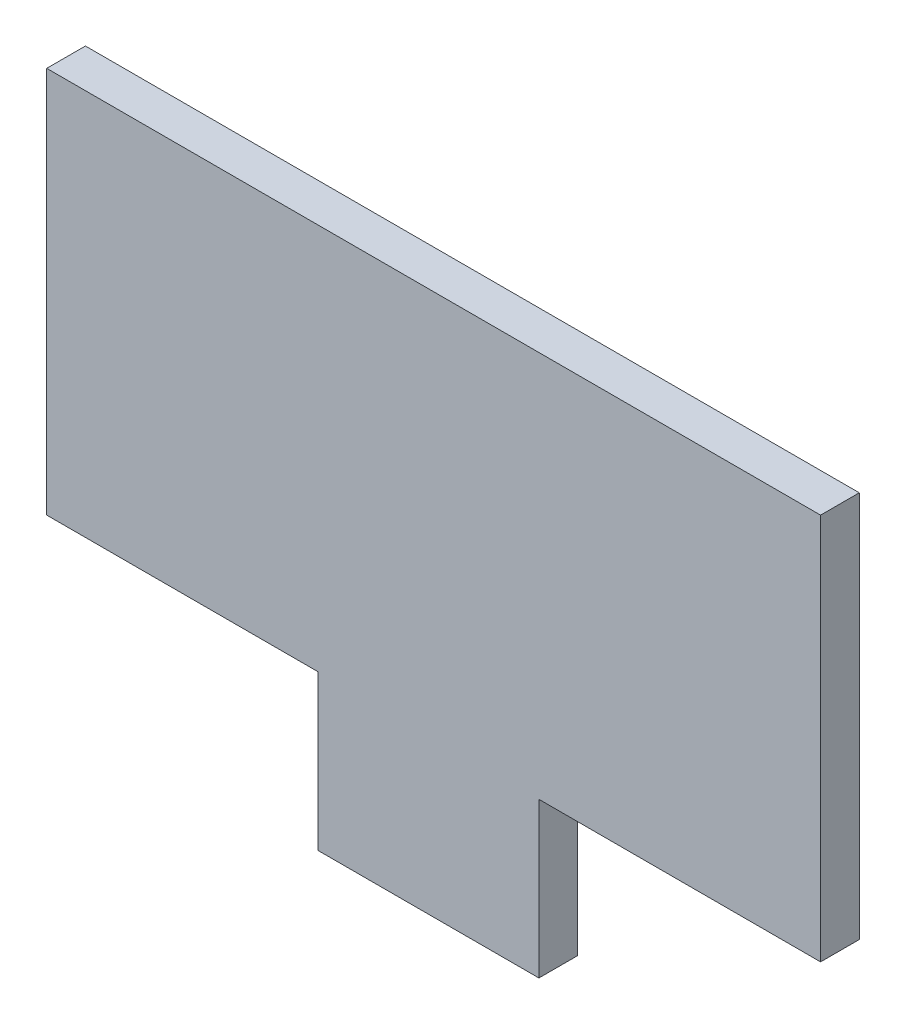
ISO-10303-21;
HEADER;
FILE_DESCRIPTION(('STEP AP214'),'2;1');
FILE_NAME('part.step','',(''),(''),'','','');
FILE_SCHEMA(('AUTOMOTIVE_DESIGN { 1 0 10303 214 1 1 1 1 }'));
ENDSEC;
DATA;
#1=APPLICATION_CONTEXT('core data for automotive mechanical design processes');
#2=APPLICATION_PROTOCOL_DEFINITION('international standard','automotive_design',2000,#1);
#3=PRODUCT_CONTEXT('',#1,'mechanical');
#4=PRODUCT('Part','Part','',(#3));
#5=PRODUCT_RELATED_PRODUCT_CATEGORY('part','',(#4));
#6=PRODUCT_DEFINITION_FORMATION('','',#4);
#7=PRODUCT_DEFINITION_CONTEXT('part definition',#1,'design');
#8=PRODUCT_DEFINITION('design','',#6,#7);
#9=PRODUCT_DEFINITION_SHAPE('','',#8);
#10=(LENGTH_UNIT() NAMED_UNIT(*) SI_UNIT(.MILLI.,.METRE.));
#11=(NAMED_UNIT(*) PLANE_ANGLE_UNIT() SI_UNIT($,.RADIAN.));
#12=(NAMED_UNIT(*) SI_UNIT($,.STERADIAN.) SOLID_ANGLE_UNIT());
#13=UNCERTAINTY_MEASURE_WITH_UNIT(LENGTH_MEASURE(1.E-05),#10,'distance_accuracy_value','');
#14=(GEOMETRIC_REPRESENTATION_CONTEXT(3) GLOBAL_UNCERTAINTY_ASSIGNED_CONTEXT((#13)) GLOBAL_UNIT_ASSIGNED_CONTEXT((#10,
#11,#12)) REPRESENTATION_CONTEXT('',''));
#15=CARTESIAN_POINT('',(0.,0.,0.));
#16=DIRECTION('',(0.,0.,1.));
#17=DIRECTION('',(1.,0.,0.));
#18=AXIS2_PLACEMENT_3D('',#15,#16,#17);
#19=CARTESIAN_POINT('',(51.2195121951221,0.,2.5));
#20=DIRECTION('',(1.,0.,0.));
#21=DIRECTION('',(0.,0.,-1.));
#22=AXIS2_PLACEMENT_3D('',#19,#20,#21);
#23=PLANE('',#22);
#24=DIRECTION('',(0.,-1.,0.));
#25=VECTOR('',#24,1.);
#26=CARTESIAN_POINT('',(51.2195121951221,0.,0.));
#27=LINE('',#26,#25);
#28=CARTESIAN_POINT('',(51.2195121951221,25.281425891182,0.));
#29=VERTEX_POINT('',#28);
#30=CARTESIAN_POINT('',(51.2195121951221,0.281425891181995,0.));
#31=VERTEX_POINT('',#30);
#32=EDGE_CURVE('E146',#29,#31,#27,.T.);
#33=ORIENTED_EDGE('',*,*,#32,.F.);
#34=DIRECTION('',(0.,0.,-1.));
#35=VECTOR('',#34,1.);
#36=CARTESIAN_POINT('',(51.2195121951221,25.281425891182,2.5));
#37=LINE('',#36,#35);
#38=CARTESIAN_POINT('',(51.2195121951221,25.281425891182,2.5));
#39=VERTEX_POINT('',#38);
#40=EDGE_CURVE('E11',#39,#29,#37,.T.);
#41=ORIENTED_EDGE('',*,*,#40,.F.);
#42=DIRECTION('',(0.,-1.,0.));
#43=VECTOR('',#42,1.);
#44=CARTESIAN_POINT('',(51.2195121951221,0.,2.5));
#45=LINE('',#44,#43);
#46=CARTESIAN_POINT('',(51.2195121951221,0.281425891181995,2.5));
#47=VERTEX_POINT('',#46);
#48=EDGE_CURVE('E200',#39,#47,#45,.T.);
#49=ORIENTED_EDGE('',*,*,#48,.T.);
#50=DIRECTION('',(0.,0.,-1.));
#51=VECTOR('',#50,1.);
#52=CARTESIAN_POINT('',(51.2195121951221,0.281425891181995,2.5));
#53=LINE('',#52,#51);
#54=EDGE_CURVE('E98',#47,#31,#53,.T.);
#55=ORIENTED_EDGE('',*,*,#54,.T.);
#56=EDGE_LOOP('',(#33,#41,#49,#55));
#57=FACE_BOUND('',#56,.T.);
#58=ADVANCED_FACE('F47',(#57),#23,.T.);
#59=CARTESIAN_POINT('',(0.,25.281425891182,2.5));
#60=DIRECTION('',(0.,1.,0.));
#61=DIRECTION('',(0.,0.,1.));
#62=AXIS2_PLACEMENT_3D('',#59,#60,#61);
#63=PLANE('',#62);
#64=DIRECTION('',(1.,0.,0.));
#65=VECTOR('',#64,1.);
#66=CARTESIAN_POINT('',(0.,25.281425891182,0.));
#67=LINE('',#66,#65);
#68=CARTESIAN_POINT('',(1.21951219512215,25.281425891182,0.));
#69=VERTEX_POINT('',#68);
#70=EDGE_CURVE('E150',#69,#29,#67,.T.);
#71=ORIENTED_EDGE('',*,*,#70,.F.);
#72=DIRECTION('',(0.,0.,-1.));
#73=VECTOR('',#72,1.);
#74=CARTESIAN_POINT('',(1.21951219512215,25.281425891182,2.5));
#75=LINE('',#74,#73);
#76=CARTESIAN_POINT('',(1.21951219512215,25.281425891182,2.5));
#77=VERTEX_POINT('',#76);
#78=EDGE_CURVE('E56',#77,#69,#75,.T.);
#79=ORIENTED_EDGE('',*,*,#78,.F.);
#80=DIRECTION('',(1.,0.,0.));
#81=VECTOR('',#80,1.);
#82=CARTESIAN_POINT('',(0.,25.281425891182,2.5));
#83=LINE('',#82,#81);
#84=EDGE_CURVE('E198',#77,#39,#83,.T.);
#85=ORIENTED_EDGE('',*,*,#84,.T.);
#86=ORIENTED_EDGE('',*,*,#40,.T.);
#87=EDGE_LOOP('',(#71,#79,#85,#86));
#88=FACE_BOUND('',#87,.T.);
#89=ADVANCED_FACE('F197',(#88),#63,.T.);
#90=CARTESIAN_POINT('',(1.21951219512215,0.,2.5));
#91=DIRECTION('',(1.,0.,0.));
#92=DIRECTION('',(0.,1.,0.));
#93=AXIS2_PLACEMENT_3D('',#90,#91,#92);
#94=PLANE('',#93);
#95=DIRECTION('',(0.,-1.,0.));
#96=VECTOR('',#95,1.);
#97=CARTESIAN_POINT('',(1.21951219512215,0.,0.));
#98=LINE('',#97,#96);
#99=CARTESIAN_POINT('',(1.21951219512215,0.281425891181995,0.));
#100=VERTEX_POINT('',#99);
#101=EDGE_CURVE('E154',#69,#100,#98,.T.);
#102=ORIENTED_EDGE('',*,*,#101,.T.);
#103=DIRECTION('',(0.,0.,-1.));
#104=VECTOR('',#103,1.);
#105=CARTESIAN_POINT('',(1.21951219512215,0.281425891181995,2.5));
#106=LINE('',#105,#104);
#107=CARTESIAN_POINT('',(1.21951219512215,0.281425891181995,2.5));
#108=VERTEX_POINT('',#107);
#109=EDGE_CURVE('E179',#108,#100,#106,.T.);
#110=ORIENTED_EDGE('',*,*,#109,.F.);
#111=DIRECTION('',(0.,-1.,0.));
#112=VECTOR('',#111,1.);
#113=CARTESIAN_POINT('',(1.21951219512215,0.,2.5));
#114=LINE('',#113,#112);
#115=EDGE_CURVE('E188',#77,#108,#114,.T.);
#116=ORIENTED_EDGE('',*,*,#115,.F.);
#117=ORIENTED_EDGE('',*,*,#78,.T.);
#118=EDGE_LOOP('',(#102,#110,#116,#117));
#119=FACE_BOUND('',#118,.T.);
#120=ADVANCED_FACE('F186',(#119),#94,.F.);
#121=CARTESIAN_POINT('',(0.,0.281425891181995,2.5));
#122=DIRECTION('',(0.,1.,0.));
#123=DIRECTION('',(0.,0.,1.));
#124=AXIS2_PLACEMENT_3D('',#121,#122,#123);
#125=PLANE('',#124);
#126=DIRECTION('',(1.,0.,0.));
#127=VECTOR('',#126,1.);
#128=CARTESIAN_POINT('',(0.,0.281425891181995,0.));
#129=LINE('',#128,#127);
#130=CARTESIAN_POINT('',(18.7617260787993,0.281425891181995,0.));
#131=VERTEX_POINT('',#130);
#132=EDGE_CURVE('E157',#100,#131,#129,.T.);
#133=ORIENTED_EDGE('',*,*,#132,.T.);
#134=DIRECTION('',(0.,0.,-1.));
#135=VECTOR('',#134,1.);
#136=CARTESIAN_POINT('',(18.7617260787993,0.281425891181995,2.5));
#137=LINE('',#136,#135);
#138=CARTESIAN_POINT('',(18.7617260787993,0.281425891181995,2.5));
#139=VERTEX_POINT('',#138);
#140=EDGE_CURVE('E175',#139,#131,#137,.T.);
#141=ORIENTED_EDGE('',*,*,#140,.F.);
#142=DIRECTION('',(1.,0.,0.));
#143=VECTOR('',#142,1.);
#144=CARTESIAN_POINT('',(0.,0.281425891181995,2.5));
#145=LINE('',#144,#143);
#146=EDGE_CURVE('E143',#108,#139,#145,.T.);
#147=ORIENTED_EDGE('',*,*,#146,.F.);
#148=ORIENTED_EDGE('',*,*,#109,.T.);
#149=EDGE_LOOP('',(#133,#141,#147,#148));
#150=FACE_BOUND('',#149,.T.);
#151=ADVANCED_FACE('F212',(#150),#125,.F.);
#152=CARTESIAN_POINT('',(18.7617260787993,0.,2.5));
#153=DIRECTION('',(1.,0.,0.));
#154=DIRECTION('',(0.,0.,-1.));
#155=AXIS2_PLACEMENT_3D('',#152,#153,#154);
#156=PLANE('',#155);
#157=DIRECTION('',(0.,-1.,0.));
#158=VECTOR('',#157,1.);
#159=CARTESIAN_POINT('',(18.7617260787993,0.,0.));
#160=LINE('',#159,#158);
#161=CARTESIAN_POINT('',(18.7617260787993,-9.71857410881801,0.));
#162=VERTEX_POINT('',#161);
#163=EDGE_CURVE('E160',#131,#162,#160,.T.);
#164=ORIENTED_EDGE('',*,*,#163,.T.);
#165=DIRECTION('',(0.,0.,-1.));
#166=VECTOR('',#165,1.);
#167=CARTESIAN_POINT('',(18.7617260787993,-9.71857410881801,2.5));
#168=LINE('',#167,#166);
#169=CARTESIAN_POINT('',(18.7617260787993,-9.71857410881801,2.5));
#170=VERTEX_POINT('',#169);
#171=EDGE_CURVE('E136',#170,#162,#168,.T.);
#172=ORIENTED_EDGE('',*,*,#171,.F.);
#173=DIRECTION('',(0.,-1.,0.));
#174=VECTOR('',#173,1.);
#175=CARTESIAN_POINT('',(18.7617260787993,0.,2.5));
#176=LINE('',#175,#174);
#177=EDGE_CURVE('E121',#139,#170,#176,.T.);
#178=ORIENTED_EDGE('',*,*,#177,.F.);
#179=ORIENTED_EDGE('',*,*,#140,.T.);
#180=EDGE_LOOP('',(#164,#172,#178,#179));
#181=FACE_BOUND('',#180,.T.);
#182=ADVANCED_FACE('F214',(#181),#156,.F.);
#183=CARTESIAN_POINT('',(0.,-9.71857410881801,2.5));
#184=DIRECTION('',(0.,1.,0.));
#185=DIRECTION('',(0.,0.,1.));
#186=AXIS2_PLACEMENT_3D('',#183,#184,#185);
#187=PLANE('',#186);
#188=DIRECTION('',(1.,0.,0.));
#189=VECTOR('',#188,1.);
#190=CARTESIAN_POINT('',(0.,-9.71857410881801,0.));
#191=LINE('',#190,#189);
#192=CARTESIAN_POINT('',(33.0206378986867,-9.71857410881801,0.));
#193=VERTEX_POINT('',#192);
#194=EDGE_CURVE('E131',#162,#193,#191,.T.);
#195=ORIENTED_EDGE('',*,*,#194,.T.);
#196=DIRECTION('',(0.,0.,-1.));
#197=VECTOR('',#196,1.);
#198=CARTESIAN_POINT('',(33.0206378986867,-9.71857410881801,2.5));
#199=LINE('',#198,#197);
#200=CARTESIAN_POINT('',(33.0206378986867,-9.71857410881801,2.5));
#201=VERTEX_POINT('',#200);
#202=EDGE_CURVE('E128',#201,#193,#199,.T.);
#203=ORIENTED_EDGE('',*,*,#202,.F.);
#204=DIRECTION('',(1.,0.,0.));
#205=VECTOR('',#204,1.);
#206=CARTESIAN_POINT('',(0.,-9.71857410881801,2.5));
#207=LINE('',#206,#205);
#208=EDGE_CURVE('E115',#170,#201,#207,.T.);
#209=ORIENTED_EDGE('',*,*,#208,.F.);
#210=ORIENTED_EDGE('',*,*,#171,.T.);
#211=EDGE_LOOP('',(#195,#203,#209,#210));
#212=FACE_BOUND('',#211,.T.);
#213=ADVANCED_FACE('F129',(#212),#187,.F.);
#214=CARTESIAN_POINT('',(33.0206378986867,0.,2.5));
#215=DIRECTION('',(1.,0.,0.));
#216=DIRECTION('',(0.,0.,-1.));
#217=AXIS2_PLACEMENT_3D('',#214,#215,#216);
#218=PLANE('',#217);
#219=DIRECTION('',(0.,-1.,0.));
#220=VECTOR('',#219,1.);
#221=CARTESIAN_POINT('',(33.0206378986867,0.,0.));
#222=LINE('',#221,#220);
#223=CARTESIAN_POINT('',(33.0206378986867,0.281425891181995,0.));
#224=VERTEX_POINT('',#223);
#225=EDGE_CURVE('E166',#224,#193,#222,.T.);
#226=ORIENTED_EDGE('',*,*,#225,.F.);
#227=DIRECTION('',(0.,0.,-1.));
#228=VECTOR('',#227,1.);
#229=CARTESIAN_POINT('',(33.0206378986867,0.281425891181995,2.5));
#230=LINE('',#229,#228);
#231=CARTESIAN_POINT('',(33.0206378986867,0.281425891181995,2.5));
#232=VERTEX_POINT('',#231);
#233=EDGE_CURVE('E91',#232,#224,#230,.T.);
#234=ORIENTED_EDGE('',*,*,#233,.F.);
#235=DIRECTION('',(0.,-1.,0.));
#236=VECTOR('',#235,1.);
#237=CARTESIAN_POINT('',(33.0206378986867,0.,2.5));
#238=LINE('',#237,#236);
#239=EDGE_CURVE('E119',#232,#201,#238,.T.);
#240=ORIENTED_EDGE('',*,*,#239,.T.);
#241=ORIENTED_EDGE('',*,*,#202,.T.);
#242=EDGE_LOOP('',(#226,#234,#240,#241));
#243=FACE_BOUND('',#242,.T.);
#244=ADVANCED_FACE('F138',(#243),#218,.T.);
#245=EDGE_CURVE('E161',#224,#31,#129,.T.);
#246=ORIENTED_EDGE('',*,*,#245,.T.);
#247=ORIENTED_EDGE('',*,*,#54,.F.);
#248=EDGE_CURVE('E64',#232,#47,#145,.T.);
#249=ORIENTED_EDGE('',*,*,#248,.F.);
#250=ORIENTED_EDGE('',*,*,#233,.T.);
#251=EDGE_LOOP('',(#246,#247,#249,#250));
#252=FACE_BOUND('',#251,.T.);
#253=ADVANCED_FACE('F223',(#252),#125,.F.);
#254=CARTESIAN_POINT('',(0.,0.,2.5));
#255=DIRECTION('',(0.,0.,1.));
#256=DIRECTION('',(1.,0.,0.));
#257=AXIS2_PLACEMENT_3D('',#254,#255,#256);
#258=PLANE('',#257);
#259=ORIENTED_EDGE('',*,*,#48,.F.);
#260=ORIENTED_EDGE('',*,*,#84,.F.);
#261=ORIENTED_EDGE('',*,*,#115,.T.);
#262=ORIENTED_EDGE('',*,*,#146,.T.);
#263=ORIENTED_EDGE('',*,*,#177,.T.);
#264=ORIENTED_EDGE('',*,*,#208,.T.);
#265=ORIENTED_EDGE('',*,*,#239,.F.);
#266=ORIENTED_EDGE('',*,*,#248,.T.);
#267=EDGE_LOOP('',(#259,#260,#261,#262,#263,#264,#265,#266));
#268=FACE_BOUND('',#267,.T.);
#269=ADVANCED_FACE('F117',(#268),#258,.T.);
#270=CARTESIAN_POINT('',(0.,0.,0.));
#271=DIRECTION('',(0.,0.,1.));
#272=DIRECTION('',(1.,0.,0.));
#273=AXIS2_PLACEMENT_3D('',#270,#271,#272);
#274=PLANE('',#273);
#275=ORIENTED_EDGE('',*,*,#32,.T.);
#276=ORIENTED_EDGE('',*,*,#245,.F.);
#277=ORIENTED_EDGE('',*,*,#225,.T.);
#278=ORIENTED_EDGE('',*,*,#194,.F.);
#279=ORIENTED_EDGE('',*,*,#163,.F.);
#280=ORIENTED_EDGE('',*,*,#132,.F.);
#281=ORIENTED_EDGE('',*,*,#101,.F.);
#282=ORIENTED_EDGE('',*,*,#70,.T.);
#283=EDGE_LOOP('',(#275,#276,#277,#278,#279,#280,#281,#282));
#284=FACE_BOUND('',#283,.T.);
#285=ADVANCED_FACE('F195',(#284),#274,.F.);
#286=CLOSED_SHELL('',(#58,#89,#120,#151,#182,#213,#244,#253,#269,#285));
#287=MANIFOLD_SOLID_BREP('B2',#286);
#288=ADVANCED_BREP_SHAPE_REPRESENTATION('',(#18,#287),#14);
#289=SHAPE_DEFINITION_REPRESENTATION(#9,#288);
ENDSEC;
END-ISO-10303-21;
